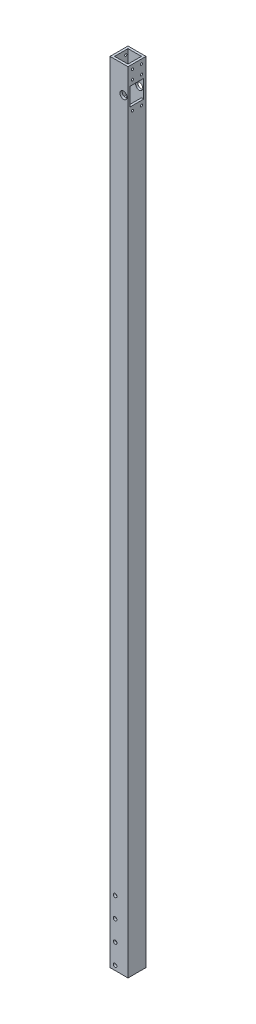
ISO-10303-21;
HEADER;
FILE_DESCRIPTION(('STEP AP214'),'2;1');
FILE_NAME('part.step','',(''),(''),'','','');
FILE_SCHEMA(('AUTOMOTIVE_DESIGN { 1 0 10303 214 1 1 1 1 }'));
ENDSEC;
DATA;
#1=APPLICATION_CONTEXT('core data for automotive mechanical design processes');
#2=APPLICATION_PROTOCOL_DEFINITION('international standard','automotive_design',2000,#1);
#3=PRODUCT_CONTEXT('',#1,'mechanical');
#4=PRODUCT('Part','Part','',(#3));
#5=PRODUCT_RELATED_PRODUCT_CATEGORY('part','',(#4));
#6=PRODUCT_DEFINITION_FORMATION('','',#4);
#7=PRODUCT_DEFINITION_CONTEXT('part definition',#1,'design');
#8=PRODUCT_DEFINITION('design','',#6,#7);
#9=PRODUCT_DEFINITION_SHAPE('','',#8);
#10=(LENGTH_UNIT() NAMED_UNIT(*) SI_UNIT(.MILLI.,.METRE.));
#11=(NAMED_UNIT(*) PLANE_ANGLE_UNIT() SI_UNIT($,.RADIAN.));
#12=(NAMED_UNIT(*) SI_UNIT($,.STERADIAN.) SOLID_ANGLE_UNIT());
#13=UNCERTAINTY_MEASURE_WITH_UNIT(LENGTH_MEASURE(1.E-05),#10,'distance_accuracy_value','');
#14=(GEOMETRIC_REPRESENTATION_CONTEXT(3) GLOBAL_UNCERTAINTY_ASSIGNED_CONTEXT((#13)) GLOBAL_UNIT_ASSIGNED_CONTEXT((#10,
#11,#12)) REPRESENTATION_CONTEXT('',''));
#15=CARTESIAN_POINT('',(0.,0.,0.));
#16=DIRECTION('',(0.,0.,1.));
#17=DIRECTION('',(1.,0.,0.));
#18=AXIS2_PLACEMENT_3D('',#15,#16,#17);
#19=CARTESIAN_POINT('',(-9.525,1117.6,-9.525));
#20=DIRECTION('',(1.,0.,0.));
#21=DIRECTION('',(0.,0.,-1.));
#22=AXIS2_PLACEMENT_3D('',#19,#20,#21);
#23=PLANE('',#22);
#24=CARTESIAN_POINT('',(-9.525,1098.55,-6.35000000000001));
#25=DIRECTION('',(1.,0.,0.));
#26=DIRECTION('',(0.,0.,-1.));
#27=AXIS2_PLACEMENT_3D('',#24,#25,#26);
#28=CIRCLE('',#27,1.58750000000007);
#29=CARTESIAN_POINT('',(-9.525,1098.55,-7.93750000000008));
#30=VERTEX_POINT('',#29);
#31=EDGE_CURVE('E243',#30,#30,#28,.T.);
#32=ORIENTED_EDGE('',*,*,#31,.F.);
#33=EDGE_LOOP('',(#32));
#34=FACE_BOUND('',#33,.T.);
#35=CARTESIAN_POINT('',(-9.525,1111.25,6.34999999999993));
#36=DIRECTION('',(1.,0.,0.));
#37=DIRECTION('',(0.,0.,-1.));
#38=AXIS2_PLACEMENT_3D('',#35,#36,#37);
#39=CIRCLE('',#38,1.58750000000007);
#40=CARTESIAN_POINT('',(-9.525,1111.25,4.76249999999986));
#41=VERTEX_POINT('',#40);
#42=EDGE_CURVE('E255',#41,#41,#39,.T.);
#43=ORIENTED_EDGE('',*,*,#42,.F.);
#44=EDGE_LOOP('',(#43));
#45=FACE_BOUND('',#44,.T.);
#46=CARTESIAN_POINT('',(-9.525,1098.55,6.34999999999993));
#47=DIRECTION('',(1.,0.,0.));
#48=DIRECTION('',(0.,0.,-1.));
#49=AXIS2_PLACEMENT_3D('',#46,#47,#48);
#50=CIRCLE('',#49,1.58750000000007);
#51=CARTESIAN_POINT('',(-9.525,1098.55,4.76249999999986));
#52=VERTEX_POINT('',#51);
#53=EDGE_CURVE('E267',#52,#52,#50,.T.);
#54=ORIENTED_EDGE('',*,*,#53,.F.);
#55=EDGE_LOOP('',(#54));
#56=FACE_BOUND('',#55,.T.);
#57=CARTESIAN_POINT('',(-9.525,1111.25,-6.35000000000001));
#58=DIRECTION('',(1.,0.,0.));
#59=DIRECTION('',(0.,0.,-1.));
#60=AXIS2_PLACEMENT_3D('',#57,#58,#59);
#61=CIRCLE('',#60,1.58750000000007);
#62=CARTESIAN_POINT('',(-9.525,1111.25,-7.93750000000008));
#63=VERTEX_POINT('',#62);
#64=EDGE_CURVE('E276',#63,#63,#61,.T.);
#65=ORIENTED_EDGE('',*,*,#64,.F.);
#66=EDGE_LOOP('',(#65));
#67=FACE_BOUND('',#66,.T.);
#68=CARTESIAN_POINT('',(-9.525,1060.45,6.34999999999993));
#69=DIRECTION('',(1.,0.,0.));
#70=DIRECTION('',(0.,0.,-1.));
#71=AXIS2_PLACEMENT_3D('',#68,#69,#70);
#72=CIRCLE('',#71,1.58750000000007);
#73=CARTESIAN_POINT('',(-9.525,1060.45,4.76249999999986));
#74=VERTEX_POINT('',#73);
#75=EDGE_CURVE('E191',#74,#74,#72,.T.);
#76=ORIENTED_EDGE('',*,*,#75,.F.);
#77=EDGE_LOOP('',(#76));
#78=FACE_BOUND('',#77,.T.);
#79=CARTESIAN_POINT('',(-9.525,1060.45,-6.34999999999994));
#80=DIRECTION('',(1.,0.,0.));
#81=DIRECTION('',(0.,0.,-1.));
#82=AXIS2_PLACEMENT_3D('',#79,#80,#81);
#83=CIRCLE('',#82,1.58750000000007);
#84=CARTESIAN_POINT('',(-9.525,1060.45,-7.93750000000002));
#85=VERTEX_POINT('',#84);
#86=EDGE_CURVE('E186',#85,#85,#83,.T.);
#87=ORIENTED_EDGE('',*,*,#86,.F.);
#88=EDGE_LOOP('',(#87));
#89=FACE_BOUND('',#88,.T.);
#90=CARTESIAN_POINT('',(-9.525,82.5500000000001,-4.44089209850063E-13));
#91=DIRECTION('',(1.,0.,0.));
#92=DIRECTION('',(0.,0.,-1.));
#93=AXIS2_PLACEMENT_3D('',#90,#91,#92);
#94=CIRCLE('',#93,2.5527);
#95=CARTESIAN_POINT('',(-9.525,82.5500000000001,-2.55270000000044));
#96=VERTEX_POINT('',#95);
#97=EDGE_CURVE('E299',#96,#96,#94,.F.);
#98=ORIENTED_EDGE('',*,*,#97,.T.);
#99=EDGE_LOOP('',(#98));
#100=FACE_BOUND('',#99,.T.);
#101=CARTESIAN_POINT('',(-9.525,57.1500000000001,-4.44089209850063E-13));
#102=DIRECTION('',(1.,0.,0.));
#103=DIRECTION('',(0.,0.,-1.));
#104=AXIS2_PLACEMENT_3D('',#101,#102,#103);
#105=CIRCLE('',#104,2.55269999999999);
#106=CARTESIAN_POINT('',(-9.525,57.1500000000001,-2.55270000000044));
#107=VERTEX_POINT('',#106);
#108=EDGE_CURVE('E305',#107,#107,#105,.F.);
#109=ORIENTED_EDGE('',*,*,#108,.T.);
#110=EDGE_LOOP('',(#109));
#111=FACE_BOUND('',#110,.T.);
#112=DIRECTION('',(0.,0.,1.));
#113=VECTOR('',#112,1.);
#114=CARTESIAN_POINT('',(-9.525,0.,-9.525));
#115=LINE('',#114,#113);
#116=CARTESIAN_POINT('',(-9.525,0.,-9.525));
#117=VERTEX_POINT('',#116);
#118=CARTESIAN_POINT('',(-9.525,0.,9.525));
#119=VERTEX_POINT('',#118);
#120=EDGE_CURVE('E348',#117,#119,#115,.T.);
#121=ORIENTED_EDGE('',*,*,#120,.F.);
#122=DIRECTION('',(0.,-1.,0.));
#123=VECTOR('',#122,1.);
#124=CARTESIAN_POINT('',(-9.525,1117.6,-9.525));
#125=LINE('',#124,#123);
#126=CARTESIAN_POINT('',(-9.525,1117.6,-9.525));
#127=VERTEX_POINT('',#126);
#128=EDGE_CURVE('E145',#127,#117,#125,.T.);
#129=ORIENTED_EDGE('',*,*,#128,.F.);
#130=DIRECTION('',(0.,0.,1.));
#131=VECTOR('',#130,1.);
#132=CARTESIAN_POINT('',(-9.525,1117.6,-9.525));
#133=LINE('',#132,#131);
#134=CARTESIAN_POINT('',(-9.525,1117.6,9.525));
#135=VERTEX_POINT('',#134);
#136=EDGE_CURVE('E341',#127,#135,#133,.T.);
#137=ORIENTED_EDGE('',*,*,#136,.T.);
#138=DIRECTION('',(0.,-1.,0.));
#139=VECTOR('',#138,1.);
#140=CARTESIAN_POINT('',(-9.525,1117.6,9.525));
#141=LINE('',#140,#139);
#142=EDGE_CURVE('E149',#135,#119,#141,.T.);
#143=ORIENTED_EDGE('',*,*,#142,.T.);
#144=EDGE_LOOP('',(#121,#129,#137,#143));
#145=FACE_BOUND('',#144,.T.);
#146=CARTESIAN_POINT('',(-9.525,12.7000000000001,-4.44089209850063E-13));
#147=DIRECTION('',(1.,0.,0.));
#148=DIRECTION('',(0.,0.,-1.));
#149=AXIS2_PLACEMENT_3D('',#146,#147,#148);
#150=CIRCLE('',#149,2.55269999999999);
#151=CARTESIAN_POINT('',(-9.525,12.7000000000001,-2.55270000000044));
#152=VERTEX_POINT('',#151);
#153=EDGE_CURVE('E311',#152,#152,#150,.F.);
#154=ORIENTED_EDGE('',*,*,#153,.T.);
#155=EDGE_LOOP('',(#154));
#156=FACE_BOUND('',#155,.T.);
#157=ADVANCED_FACE('F32',(#34,#45,#56,#67,#78,#89,#100,#111,#145,#156),#23,.T.);
#158=CARTESIAN_POINT('',(9.525,1117.6,-9.525));
#159=DIRECTION('',(-1.,0.,0.));
#160=DIRECTION('',(0.,0.,1.));
#161=AXIS2_PLACEMENT_3D('',#158,#159,#160);
#162=PLANE('',#161);
#163=CARTESIAN_POINT('',(9.525,1098.55,-6.35000000000001));
#164=DIRECTION('',(-1.,0.,0.));
#165=DIRECTION('',(0.,0.,1.));
#166=AXIS2_PLACEMENT_3D('',#163,#164,#165);
#167=CIRCLE('',#166,1.58750000000007);
#168=CARTESIAN_POINT('',(9.525,1098.55,-4.76249999999993));
#169=VERTEX_POINT('',#168);
#170=EDGE_CURVE('E240',#169,#169,#167,.T.);
#171=ORIENTED_EDGE('',*,*,#170,.F.);
#172=EDGE_LOOP('',(#171));
#173=FACE_BOUND('',#172,.T.);
#174=CARTESIAN_POINT('',(9.525,1111.25,6.34999999999993));
#175=DIRECTION('',(-1.,0.,0.));
#176=DIRECTION('',(0.,0.,1.));
#177=AXIS2_PLACEMENT_3D('',#174,#175,#176);
#178=CIRCLE('',#177,1.58750000000007);
#179=CARTESIAN_POINT('',(9.525,1111.25,7.93750000000001));
#180=VERTEX_POINT('',#179);
#181=EDGE_CURVE('E252',#180,#180,#178,.T.);
#182=ORIENTED_EDGE('',*,*,#181,.F.);
#183=EDGE_LOOP('',(#182));
#184=FACE_BOUND('',#183,.T.);
#185=CARTESIAN_POINT('',(9.525,1098.55,6.34999999999993));
#186=DIRECTION('',(-1.,0.,0.));
#187=DIRECTION('',(0.,0.,1.));
#188=AXIS2_PLACEMENT_3D('',#185,#186,#187);
#189=CIRCLE('',#188,1.58750000000007);
#190=CARTESIAN_POINT('',(9.525,1098.55,7.93750000000001));
#191=VERTEX_POINT('',#190);
#192=EDGE_CURVE('E264',#191,#191,#189,.T.);
#193=ORIENTED_EDGE('',*,*,#192,.F.);
#194=EDGE_LOOP('',(#193));
#195=FACE_BOUND('',#194,.T.);
#196=CARTESIAN_POINT('',(9.525,1111.25,-6.35000000000001));
#197=DIRECTION('',(-1.,0.,0.));
#198=DIRECTION('',(0.,0.,1.));
#199=AXIS2_PLACEMENT_3D('',#196,#197,#198);
#200=CIRCLE('',#199,1.58750000000007);
#201=CARTESIAN_POINT('',(9.525,1111.25,-4.76249999999993));
#202=VERTEX_POINT('',#201);
#203=EDGE_CURVE('E279',#202,#202,#200,.T.);
#204=ORIENTED_EDGE('',*,*,#203,.F.);
#205=EDGE_LOOP('',(#204));
#206=FACE_BOUND('',#205,.T.);
#207=DIRECTION('',(0.,0.,1.));
#208=VECTOR('',#207,1.);
#209=CARTESIAN_POINT('',(9.525,1092.2,9.525));
#210=LINE('',#209,#208);
#211=CARTESIAN_POINT('',(9.525,1092.2,-9.525));
#212=VERTEX_POINT('',#211);
#213=CARTESIAN_POINT('',(9.525,1092.2,9.525));
#214=VERTEX_POINT('',#213);
#215=EDGE_CURVE('E329',#212,#214,#210,.T.);
#216=ORIENTED_EDGE('',*,*,#215,.T.);
#217=DIRECTION('',(0.,-1.,0.));
#218=VECTOR('',#217,1.);
#219=CARTESIAN_POINT('',(9.525,1117.6,9.525));
#220=LINE('',#219,#218);
#221=CARTESIAN_POINT('',(9.525,1117.6,9.525));
#222=VERTEX_POINT('',#221);
#223=EDGE_CURVE('E353',#222,#214,#220,.T.);
#224=ORIENTED_EDGE('',*,*,#223,.F.);
#225=DIRECTION('',(0.,0.,-1.));
#226=VECTOR('',#225,1.);
#227=CARTESIAN_POINT('',(9.525,1117.6,-9.525));
#228=LINE('',#227,#226);
#229=CARTESIAN_POINT('',(9.525,1117.6,-9.525));
#230=VERTEX_POINT('',#229);
#231=EDGE_CURVE('E336',#222,#230,#228,.T.);
#232=ORIENTED_EDGE('',*,*,#231,.T.);
#233=DIRECTION('',(0.,-1.,0.));
#234=VECTOR('',#233,1.);
#235=CARTESIAN_POINT('',(9.525,1117.6,-9.525));
#236=LINE('',#235,#234);
#237=EDGE_CURVE('E144',#230,#212,#236,.T.);
#238=ORIENTED_EDGE('',*,*,#237,.T.);
#239=EDGE_LOOP('',(#216,#224,#232,#238));
#240=FACE_BOUND('',#239,.T.);
#241=ADVANCED_FACE('F375',(#173,#184,#195,#206,#240),#162,.T.);
#242=CARTESIAN_POINT('',(0.,1117.6,0.));
#243=DIRECTION('',(0.,1.,0.));
#244=DIRECTION('',(0.,0.,1.));
#245=AXIS2_PLACEMENT_3D('',#242,#243,#244);
#246=PLANE('',#245);
#247=DIRECTION('',(0.,0.,-1.));
#248=VECTOR('',#247,1.);
#249=CARTESIAN_POINT('',(12.7,1117.6,-12.7));
#250=LINE('',#249,#248);
#251=CARTESIAN_POINT('',(12.7,1117.6,12.7));
#252=VERTEX_POINT('',#251);
#253=CARTESIAN_POINT('',(12.7,1117.6,-12.7));
#254=VERTEX_POINT('',#253);
#255=EDGE_CURVE('E153',#252,#254,#250,.T.);
#256=ORIENTED_EDGE('',*,*,#255,.T.);
#257=DIRECTION('',(-1.,0.,0.));
#258=VECTOR('',#257,1.);
#259=CARTESIAN_POINT('',(-12.7,1117.6,-12.7));
#260=LINE('',#259,#258);
#261=CARTESIAN_POINT('',(-12.7,1117.6,-12.7));
#262=VERTEX_POINT('',#261);
#263=EDGE_CURVE('E156',#254,#262,#260,.T.);
#264=ORIENTED_EDGE('',*,*,#263,.T.);
#265=DIRECTION('',(0.,0.,1.));
#266=VECTOR('',#265,1.);
#267=CARTESIAN_POINT('',(-12.7,1117.6,-12.7));
#268=LINE('',#267,#266);
#269=CARTESIAN_POINT('',(-12.7,1117.6,12.7));
#270=VERTEX_POINT('',#269);
#271=EDGE_CURVE('E159',#262,#270,#268,.T.);
#272=ORIENTED_EDGE('',*,*,#271,.T.);
#273=DIRECTION('',(1.,0.,0.));
#274=VECTOR('',#273,1.);
#275=CARTESIAN_POINT('',(-12.7,1117.6,12.7));
#276=LINE('',#275,#274);
#277=EDGE_CURVE('E161',#270,#252,#276,.T.);
#278=ORIENTED_EDGE('',*,*,#277,.T.);
#279=EDGE_LOOP('',(#256,#264,#272,#278));
#280=FACE_BOUND('',#279,.T.);
#281=DIRECTION('',(-1.,0.,0.));
#282=VECTOR('',#281,1.);
#283=CARTESIAN_POINT('',(-9.525,1117.6,-9.525));
#284=LINE('',#283,#282);
#285=EDGE_CURVE('E338',#230,#127,#284,.T.);
#286=ORIENTED_EDGE('',*,*,#285,.F.);
#287=ORIENTED_EDGE('',*,*,#231,.F.);
#288=DIRECTION('',(1.,0.,0.));
#289=VECTOR('',#288,1.);
#290=CARTESIAN_POINT('',(-9.525,1117.6,9.525));
#291=LINE('',#290,#289);
#292=EDGE_CURVE('E344',#135,#222,#291,.T.);
#293=ORIENTED_EDGE('',*,*,#292,.F.);
#294=ORIENTED_EDGE('',*,*,#136,.F.);
#295=EDGE_LOOP('',(#286,#287,#293,#294));
#296=FACE_BOUND('',#295,.T.);
#297=ADVANCED_FACE('F366',(#280,#296),#246,.T.);
#298=CARTESIAN_POINT('',(0.,0.,0.));
#299=DIRECTION('',(0.,1.,0.));
#300=DIRECTION('',(0.,0.,1.));
#301=AXIS2_PLACEMENT_3D('',#298,#299,#300);
#302=PLANE('',#301);
#303=DIRECTION('',(0.,0.,-1.));
#304=VECTOR('',#303,1.);
#305=CARTESIAN_POINT('',(12.7,0.,-12.7));
#306=LINE('',#305,#304);
#307=CARTESIAN_POINT('',(12.7,0.,12.7));
#308=VERTEX_POINT('',#307);
#309=CARTESIAN_POINT('',(12.7,0.,-12.7));
#310=VERTEX_POINT('',#309);
#311=EDGE_CURVE('E148',#308,#310,#306,.T.);
#312=ORIENTED_EDGE('',*,*,#311,.F.);
#313=DIRECTION('',(1.,0.,0.));
#314=VECTOR('',#313,1.);
#315=CARTESIAN_POINT('',(-12.7,0.,12.7));
#316=LINE('',#315,#314);
#317=CARTESIAN_POINT('',(-12.7,0.,12.7));
#318=VERTEX_POINT('',#317);
#319=EDGE_CURVE('E157',#318,#308,#316,.T.);
#320=ORIENTED_EDGE('',*,*,#319,.F.);
#321=DIRECTION('',(0.,0.,1.));
#322=VECTOR('',#321,1.);
#323=CARTESIAN_POINT('',(-12.7,0.,-12.7));
#324=LINE('',#323,#322);
#325=CARTESIAN_POINT('',(-12.7,0.,-12.7));
#326=VERTEX_POINT('',#325);
#327=EDGE_CURVE('E168',#326,#318,#324,.T.);
#328=ORIENTED_EDGE('',*,*,#327,.F.);
#329=DIRECTION('',(-1.,0.,0.));
#330=VECTOR('',#329,1.);
#331=CARTESIAN_POINT('',(-12.7,0.,-12.7));
#332=LINE('',#331,#330);
#333=EDGE_CURVE('E166',#310,#326,#332,.T.);
#334=ORIENTED_EDGE('',*,*,#333,.F.);
#335=EDGE_LOOP('',(#312,#320,#328,#334));
#336=FACE_BOUND('',#335,.T.);
#337=DIRECTION('',(0.,0.,-1.));
#338=VECTOR('',#337,1.);
#339=CARTESIAN_POINT('',(9.525,0.,-9.525));
#340=LINE('',#339,#338);
#341=CARTESIAN_POINT('',(9.525,0.,9.525));
#342=VERTEX_POINT('',#341);
#343=CARTESIAN_POINT('',(9.525,0.,-9.525));
#344=VERTEX_POINT('',#343);
#345=EDGE_CURVE('E324',#342,#344,#340,.T.);
#346=ORIENTED_EDGE('',*,*,#345,.T.);
#347=DIRECTION('',(-1.,0.,0.));
#348=VECTOR('',#347,1.);
#349=CARTESIAN_POINT('',(-9.525,0.,-9.525));
#350=LINE('',#349,#348);
#351=EDGE_CURVE('E142',#344,#117,#350,.T.);
#352=ORIENTED_EDGE('',*,*,#351,.T.);
#353=ORIENTED_EDGE('',*,*,#120,.T.);
#354=DIRECTION('',(1.,0.,0.));
#355=VECTOR('',#354,1.);
#356=CARTESIAN_POINT('',(-9.525,0.,9.525));
#357=LINE('',#356,#355);
#358=EDGE_CURVE('E339',#119,#342,#357,.T.);
#359=ORIENTED_EDGE('',*,*,#358,.T.);
#360=EDGE_LOOP('',(#346,#352,#353,#359));
#361=FACE_BOUND('',#360,.T.);
#362=ADVANCED_FACE('F364',(#336,#361),#302,.F.);
#363=CARTESIAN_POINT('',(12.7,1117.6,-12.7));
#364=DIRECTION('',(-1.,0.,0.));
#365=DIRECTION('',(0.,0.,1.));
#366=AXIS2_PLACEMENT_3D('',#363,#364,#365);
#367=PLANE('',#366);
#368=CARTESIAN_POINT('',(12.7,1098.55,-6.35000000000001));
#369=DIRECTION('',(1.,0.,0.));
#370=DIRECTION('',(0.,0.,-1.));
#371=AXIS2_PLACEMENT_3D('',#368,#369,#370);
#372=CIRCLE('',#371,1.58750000000007);
#373=CARTESIAN_POINT('',(12.7,1098.55,-7.93750000000008));
#374=VERTEX_POINT('',#373);
#375=EDGE_CURVE('E234',#374,#374,#372,.T.);
#376=ORIENTED_EDGE('',*,*,#375,.F.);
#377=EDGE_LOOP('',(#376));
#378=FACE_BOUND('',#377,.T.);
#379=CARTESIAN_POINT('',(12.7,1111.25,6.34999999999993));
#380=DIRECTION('',(1.,0.,0.));
#381=DIRECTION('',(0.,0.,-1.));
#382=AXIS2_PLACEMENT_3D('',#379,#380,#381);
#383=CIRCLE('',#382,1.58750000000007);
#384=CARTESIAN_POINT('',(12.7,1111.25,4.76249999999986));
#385=VERTEX_POINT('',#384);
#386=EDGE_CURVE('E246',#385,#385,#383,.T.);
#387=ORIENTED_EDGE('',*,*,#386,.F.);
#388=EDGE_LOOP('',(#387));
#389=FACE_BOUND('',#388,.T.);
#390=CARTESIAN_POINT('',(12.7,1098.55,6.34999999999993));
#391=DIRECTION('',(1.,0.,0.));
#392=DIRECTION('',(0.,0.,-1.));
#393=AXIS2_PLACEMENT_3D('',#390,#391,#392);
#394=CIRCLE('',#393,1.58750000000007);
#395=CARTESIAN_POINT('',(12.7,1098.55,4.76249999999986));
#396=VERTEX_POINT('',#395);
#397=EDGE_CURVE('E258',#396,#396,#394,.T.);
#398=ORIENTED_EDGE('',*,*,#397,.F.);
#399=EDGE_LOOP('',(#398));
#400=FACE_BOUND('',#399,.T.);
#401=CARTESIAN_POINT('',(12.7,1111.25,-6.35000000000001));
#402=DIRECTION('',(1.,0.,0.));
#403=DIRECTION('',(0.,0.,-1.));
#404=AXIS2_PLACEMENT_3D('',#401,#402,#403);
#405=CIRCLE('',#404,1.58750000000007);
#406=CARTESIAN_POINT('',(12.7,1111.25,-7.93750000000008));
#407=VERTEX_POINT('',#406);
#408=EDGE_CURVE('E270',#407,#407,#405,.T.);
#409=ORIENTED_EDGE('',*,*,#408,.F.);
#410=EDGE_LOOP('',(#409));
#411=FACE_BOUND('',#410,.T.);
#412=CARTESIAN_POINT('',(12.7,1060.45,6.34999999999993));
#413=DIRECTION('',(1.,0.,0.));
#414=DIRECTION('',(0.,0.,-1.));
#415=AXIS2_PLACEMENT_3D('',#412,#413,#414);
#416=CIRCLE('',#415,1.58750000000007);
#417=CARTESIAN_POINT('',(12.7,1060.45,4.76249999999986));
#418=VERTEX_POINT('',#417);
#419=EDGE_CURVE('E282',#418,#418,#416,.T.);
#420=ORIENTED_EDGE('',*,*,#419,.F.);
#421=EDGE_LOOP('',(#420));
#422=FACE_BOUND('',#421,.T.);
#423=CARTESIAN_POINT('',(12.7,1060.45,-6.34999999999994));
#424=DIRECTION('',(1.,0.,0.));
#425=DIRECTION('',(0.,0.,-1.));
#426=AXIS2_PLACEMENT_3D('',#423,#424,#425);
#427=CIRCLE('',#426,1.58750000000007);
#428=CARTESIAN_POINT('',(12.7,1060.45,-7.93750000000002));
#429=VERTEX_POINT('',#428);
#430=EDGE_CURVE('E289',#429,#429,#427,.T.);
#431=ORIENTED_EDGE('',*,*,#430,.F.);
#432=EDGE_LOOP('',(#431));
#433=FACE_BOUND('',#432,.T.);
#434=DIRECTION('',(0.,0.,-1.));
#435=VECTOR('',#434,1.);
#436=CARTESIAN_POINT('',(12.7,1066.8,9.525));
#437=LINE('',#436,#435);
#438=CARTESIAN_POINT('',(12.7,1066.8,9.525));
#439=VERTEX_POINT('',#438);
#440=CARTESIAN_POINT('',(12.7,1066.8,-9.525));
#441=VERTEX_POINT('',#440);
#442=EDGE_CURVE('E126',#439,#441,#437,.T.);
#443=ORIENTED_EDGE('',*,*,#442,.F.);
#444=DIRECTION('',(0.,-1.,0.));
#445=VECTOR('',#444,1.);
#446=CARTESIAN_POINT('',(12.7,1092.2,9.525));
#447=LINE('',#446,#445);
#448=CARTESIAN_POINT('',(12.7,1092.2,9.525));
#449=VERTEX_POINT('',#448);
#450=EDGE_CURVE('E49',#449,#439,#447,.T.);
#451=ORIENTED_EDGE('',*,*,#450,.F.);
#452=DIRECTION('',(0.,0.,1.));
#453=VECTOR('',#452,1.);
#454=CARTESIAN_POINT('',(12.7,1092.2,9.525));
#455=LINE('',#454,#453);
#456=CARTESIAN_POINT('',(12.7,1092.2,-9.525));
#457=VERTEX_POINT('',#456);
#458=EDGE_CURVE('E321',#457,#449,#455,.T.);
#459=ORIENTED_EDGE('',*,*,#458,.F.);
#460=DIRECTION('',(0.,1.,0.));
#461=VECTOR('',#460,1.);
#462=CARTESIAN_POINT('',(12.7,1092.2,-9.525));
#463=LINE('',#462,#461);
#464=EDGE_CURVE('E325',#441,#457,#463,.T.);
#465=ORIENTED_EDGE('',*,*,#464,.F.);
#466=EDGE_LOOP('',(#443,#451,#459,#465));
#467=FACE_BOUND('',#466,.T.);
#468=ORIENTED_EDGE('',*,*,#311,.T.);
#469=DIRECTION('',(0.,-1.,0.));
#470=VECTOR('',#469,1.);
#471=CARTESIAN_POINT('',(12.7,1117.6,-12.7));
#472=LINE('',#471,#470);
#473=EDGE_CURVE('E11',#254,#310,#472,.T.);
#474=ORIENTED_EDGE('',*,*,#473,.F.);
#475=ORIENTED_EDGE('',*,*,#255,.F.);
#476=DIRECTION('',(0.,-1.,0.));
#477=VECTOR('',#476,1.);
#478=CARTESIAN_POINT('',(12.7,1117.6,12.7));
#479=LINE('',#478,#477);
#480=EDGE_CURVE('E163',#252,#308,#479,.T.);
#481=ORIENTED_EDGE('',*,*,#480,.T.);
#482=EDGE_LOOP('',(#468,#474,#475,#481));
#483=FACE_BOUND('',#482,.T.);
#484=ADVANCED_FACE('F34',(#378,#389,#400,#411,#422,#433,#467,#483),#367,.F.);
#485=CARTESIAN_POINT('',(-12.7,1117.6,-12.7));
#486=DIRECTION('',(0.,0.,1.));
#487=DIRECTION('',(1.,0.,0.));
#488=AXIS2_PLACEMENT_3D('',#485,#486,#487);
#489=PLANE('',#488);
#490=CARTESIAN_POINT('',(-5.55624999999339,6.35000000000233,-12.7));
#491=DIRECTION('',(0.,0.,1.));
#492=DIRECTION('',(1.,0.,0.));
#493=AXIS2_PLACEMENT_3D('',#490,#491,#492);
#494=CIRCLE('',#493,2.5527);
#495=CARTESIAN_POINT('',(-3.0035499999934,6.35000000000233,-12.7));
#496=VERTEX_POINT('',#495);
#497=EDGE_CURVE('E717',#496,#496,#494,.T.);
#498=ORIENTED_EDGE('',*,*,#497,.T.);
#499=EDGE_LOOP('',(#498));
#500=FACE_BOUND('',#499,.T.);
#501=CARTESIAN_POINT('',(-5.55624999999339,34.9250000000023,-12.7));
#502=DIRECTION('',(0.,0.,1.));
#503=DIRECTION('',(1.,0.,0.));
#504=AXIS2_PLACEMENT_3D('',#501,#502,#503);
#505=CIRCLE('',#504,2.5527);
#506=CARTESIAN_POINT('',(-3.0035499999934,34.9250000000023,-12.7));
#507=VERTEX_POINT('',#506);
#508=EDGE_CURVE('E205',#507,#507,#505,.T.);
#509=ORIENTED_EDGE('',*,*,#508,.T.);
#510=EDGE_LOOP('',(#509));
#511=FACE_BOUND('',#510,.T.);
#512=CARTESIAN_POINT('',(-5.55624999999339,92.0750000000023,-12.7));
#513=DIRECTION('',(0.,0.,1.));
#514=DIRECTION('',(1.,0.,0.));
#515=AXIS2_PLACEMENT_3D('',#512,#513,#514);
#516=CIRCLE('',#515,2.5527);
#517=CARTESIAN_POINT('',(-3.0035499999934,92.0750000000023,-12.7));
#518=VERTEX_POINT('',#517);
#519=EDGE_CURVE('E201',#518,#518,#516,.T.);
#520=ORIENTED_EDGE('',*,*,#519,.T.);
#521=EDGE_LOOP('',(#520));
#522=FACE_BOUND('',#521,.T.);
#523=CARTESIAN_POINT('',(-5.55624999999339,63.5000000000023,-12.7));
#524=DIRECTION('',(0.,0.,1.));
#525=DIRECTION('',(1.,0.,0.));
#526=AXIS2_PLACEMENT_3D('',#523,#524,#525);
#527=CIRCLE('',#526,2.5527);
#528=CARTESIAN_POINT('',(-3.0035499999934,63.5000000000023,-12.7));
#529=VERTEX_POINT('',#528);
#530=EDGE_CURVE('E197',#529,#529,#527,.T.);
#531=ORIENTED_EDGE('',*,*,#530,.T.);
#532=EDGE_LOOP('',(#531));
#533=FACE_BOUND('',#532,.T.);
#534=CARTESIAN_POINT('',(6.35,1079.5,-12.7));
#535=DIRECTION('',(0.,0.,1.));
#536=DIRECTION('',(1.,0.,0.));
#537=AXIS2_PLACEMENT_3D('',#534,#535,#536);
#538=CIRCLE('',#537,5.0419);
#539=CARTESIAN_POINT('',(11.3919,1079.5,-12.7));
#540=VERTEX_POINT('',#539);
#541=EDGE_CURVE('E182',#540,#540,#538,.T.);
#542=ORIENTED_EDGE('',*,*,#541,.T.);
#543=EDGE_LOOP('',(#542));
#544=FACE_BOUND('',#543,.T.);
#545=ORIENTED_EDGE('',*,*,#333,.T.);
#546=DIRECTION('',(0.,-1.,0.));
#547=VECTOR('',#546,1.);
#548=CARTESIAN_POINT('',(-12.7,1117.6,-12.7));
#549=LINE('',#548,#547);
#550=EDGE_CURVE('E41',#262,#326,#549,.T.);
#551=ORIENTED_EDGE('',*,*,#550,.F.);
#552=ORIENTED_EDGE('',*,*,#263,.F.);
#553=ORIENTED_EDGE('',*,*,#473,.T.);
#554=EDGE_LOOP('',(#545,#551,#552,#553));
#555=FACE_BOUND('',#554,.T.);
#556=ADVANCED_FACE('F373',(#500,#511,#522,#533,#544,#555),#489,.F.);
#557=CARTESIAN_POINT('',(-12.7,1117.6,-12.7));
#558=DIRECTION('',(1.,0.,0.));
#559=DIRECTION('',(0.,0.,-1.));
#560=AXIS2_PLACEMENT_3D('',#557,#558,#559);
#561=PLANE('',#560);
#562=CARTESIAN_POINT('',(-12.7,1098.55,-6.35000000000001));
#563=DIRECTION('',(1.,0.,0.));
#564=DIRECTION('',(0.,0.,-1.));
#565=AXIS2_PLACEMENT_3D('',#562,#563,#564);
#566=CIRCLE('',#565,1.58750000000007);
#567=CARTESIAN_POINT('',(-12.7,1098.55,-7.93750000000008));
#568=VERTEX_POINT('',#567);
#569=EDGE_CURVE('E237',#568,#568,#566,.T.);
#570=ORIENTED_EDGE('',*,*,#569,.T.);
#571=EDGE_LOOP('',(#570));
#572=FACE_BOUND('',#571,.T.);
#573=CARTESIAN_POINT('',(-12.7,1111.25,6.34999999999993));
#574=DIRECTION('',(1.,0.,0.));
#575=DIRECTION('',(0.,0.,-1.));
#576=AXIS2_PLACEMENT_3D('',#573,#574,#575);
#577=CIRCLE('',#576,1.58750000000007);
#578=CARTESIAN_POINT('',(-12.7,1111.25,4.76249999999986));
#579=VERTEX_POINT('',#578);
#580=EDGE_CURVE('E249',#579,#579,#577,.T.);
#581=ORIENTED_EDGE('',*,*,#580,.T.);
#582=EDGE_LOOP('',(#581));
#583=FACE_BOUND('',#582,.T.);
#584=CARTESIAN_POINT('',(-12.7,1098.55,6.34999999999993));
#585=DIRECTION('',(1.,0.,0.));
#586=DIRECTION('',(0.,0.,-1.));
#587=AXIS2_PLACEMENT_3D('',#584,#585,#586);
#588=CIRCLE('',#587,1.58750000000007);
#589=CARTESIAN_POINT('',(-12.7,1098.55,4.76249999999986));
#590=VERTEX_POINT('',#589);
#591=EDGE_CURVE('E261',#590,#590,#588,.T.);
#592=ORIENTED_EDGE('',*,*,#591,.T.);
#593=EDGE_LOOP('',(#592));
#594=FACE_BOUND('',#593,.T.);
#595=CARTESIAN_POINT('',(-12.7,1111.25,-6.35000000000001));
#596=DIRECTION('',(1.,0.,0.));
#597=DIRECTION('',(0.,0.,-1.));
#598=AXIS2_PLACEMENT_3D('',#595,#596,#597);
#599=CIRCLE('',#598,1.58750000000007);
#600=CARTESIAN_POINT('',(-12.7,1111.25,-7.93750000000008));
#601=VERTEX_POINT('',#600);
#602=EDGE_CURVE('E273',#601,#601,#599,.T.);
#603=ORIENTED_EDGE('',*,*,#602,.T.);
#604=EDGE_LOOP('',(#603));
#605=FACE_BOUND('',#604,.T.);
#606=CARTESIAN_POINT('',(-12.7,1060.45,6.34999999999993));
#607=DIRECTION('',(1.,0.,0.));
#608=DIRECTION('',(0.,0.,-1.));
#609=AXIS2_PLACEMENT_3D('',#606,#607,#608);
#610=CIRCLE('',#609,1.58750000000007);
#611=CARTESIAN_POINT('',(-12.7,1060.45,4.76249999999986));
#612=VERTEX_POINT('',#611);
#613=EDGE_CURVE('E192',#612,#612,#610,.T.);
#614=ORIENTED_EDGE('',*,*,#613,.T.);
#615=EDGE_LOOP('',(#614));
#616=FACE_BOUND('',#615,.T.);
#617=CARTESIAN_POINT('',(-12.7,1060.45,-6.34999999999994));
#618=DIRECTION('',(1.,0.,0.));
#619=DIRECTION('',(0.,0.,-1.));
#620=AXIS2_PLACEMENT_3D('',#617,#618,#619);
#621=CIRCLE('',#620,1.58750000000007);
#622=CARTESIAN_POINT('',(-12.7,1060.45,-7.93750000000002));
#623=VERTEX_POINT('',#622);
#624=EDGE_CURVE('E187',#623,#623,#621,.T.);
#625=ORIENTED_EDGE('',*,*,#624,.T.);
#626=EDGE_LOOP('',(#625));
#627=FACE_BOUND('',#626,.T.);
#628=CARTESIAN_POINT('',(-12.7,82.5500000000001,-4.44089209850063E-13));
#629=DIRECTION('',(-1.,0.,0.));
#630=DIRECTION('',(0.,0.,1.));
#631=AXIS2_PLACEMENT_3D('',#628,#629,#630);
#632=CIRCLE('',#631,2.55269999999999);
#633=CARTESIAN_POINT('',(-12.7,82.5500000000001,2.55269999999955));
#634=VERTEX_POINT('',#633);
#635=EDGE_CURVE('E296',#634,#634,#632,.T.);
#636=ORIENTED_EDGE('',*,*,#635,.F.);
#637=EDGE_LOOP('',(#636));
#638=FACE_BOUND('',#637,.T.);
#639=CARTESIAN_POINT('',(-12.7,57.1500000000001,-4.44089209850063E-13));
#640=DIRECTION('',(-1.,0.,0.));
#641=DIRECTION('',(0.,0.,1.));
#642=AXIS2_PLACEMENT_3D('',#639,#640,#641);
#643=CIRCLE('',#642,2.55269999999999);
#644=CARTESIAN_POINT('',(-12.7,57.1500000000001,2.55269999999955));
#645=VERTEX_POINT('',#644);
#646=EDGE_CURVE('E302',#645,#645,#643,.T.);
#647=ORIENTED_EDGE('',*,*,#646,.F.);
#648=EDGE_LOOP('',(#647));
#649=FACE_BOUND('',#648,.T.);
#650=CARTESIAN_POINT('',(-12.7,12.7000000000001,-4.44089209850063E-13));
#651=DIRECTION('',(-1.,0.,0.));
#652=DIRECTION('',(0.,0.,1.));
#653=AXIS2_PLACEMENT_3D('',#650,#651,#652);
#654=CIRCLE('',#653,2.55269999999999);
#655=CARTESIAN_POINT('',(-12.7,12.7000000000001,2.55269999999955));
#656=VERTEX_POINT('',#655);
#657=EDGE_CURVE('E308',#656,#656,#654,.T.);
#658=ORIENTED_EDGE('',*,*,#657,.F.);
#659=EDGE_LOOP('',(#658));
#660=FACE_BOUND('',#659,.T.);
#661=ORIENTED_EDGE('',*,*,#327,.T.);
#662=DIRECTION('',(0.,-1.,0.));
#663=VECTOR('',#662,1.);
#664=CARTESIAN_POINT('',(-12.7,1117.6,12.7));
#665=LINE('',#664,#663);
#666=EDGE_CURVE('E173',#270,#318,#665,.T.);
#667=ORIENTED_EDGE('',*,*,#666,.F.);
#668=ORIENTED_EDGE('',*,*,#271,.F.);
#669=ORIENTED_EDGE('',*,*,#550,.T.);
#670=EDGE_LOOP('',(#661,#667,#668,#669));
#671=FACE_BOUND('',#670,.T.);
#672=ADVANCED_FACE('F401',(#572,#583,#594,#605,#616,#627,#638,#649,#660,#671),#561,.F.);
#673=CARTESIAN_POINT('',(-12.7,1117.6,12.7));
#674=DIRECTION('',(0.,0.,-1.));
#675=DIRECTION('',(-1.,0.,0.));
#676=AXIS2_PLACEMENT_3D('',#673,#674,#675);
#677=PLANE('',#676);
#678=CARTESIAN_POINT('',(-5.55624999999339,6.35000000000233,12.7));
#679=DIRECTION('',(0.,0.,1.));
#680=DIRECTION('',(1.,0.,0.));
#681=AXIS2_PLACEMENT_3D('',#678,#679,#680);
#682=CIRCLE('',#681,2.5527);
#683=CARTESIAN_POINT('',(-3.00354999999339,6.35000000000233,12.7));
#684=VERTEX_POINT('',#683);
#685=EDGE_CURVE('E718',#684,#684,#682,.T.);
#686=ORIENTED_EDGE('',*,*,#685,.F.);
#687=EDGE_LOOP('',(#686));
#688=FACE_BOUND('',#687,.T.);
#689=CARTESIAN_POINT('',(-5.55624999999339,34.9250000000023,12.7));
#690=DIRECTION('',(0.,0.,1.));
#691=DIRECTION('',(1.,0.,0.));
#692=AXIS2_PLACEMENT_3D('',#689,#690,#691);
#693=CIRCLE('',#692,2.5527);
#694=CARTESIAN_POINT('',(-3.00354999999339,34.9250000000023,12.7));
#695=VERTEX_POINT('',#694);
#696=EDGE_CURVE('E212',#695,#695,#693,.T.);
#697=ORIENTED_EDGE('',*,*,#696,.F.);
#698=EDGE_LOOP('',(#697));
#699=FACE_BOUND('',#698,.T.);
#700=CARTESIAN_POINT('',(-5.55624999999339,92.0750000000023,12.7));
#701=DIRECTION('',(0.,0.,1.));
#702=DIRECTION('',(1.,0.,0.));
#703=AXIS2_PLACEMENT_3D('',#700,#701,#702);
#704=CIRCLE('',#703,2.5527);
#705=CARTESIAN_POINT('',(-3.00354999999339,92.0750000000023,12.7));
#706=VERTEX_POINT('',#705);
#707=EDGE_CURVE('E209',#706,#706,#704,.T.);
#708=ORIENTED_EDGE('',*,*,#707,.F.);
#709=EDGE_LOOP('',(#708));
#710=FACE_BOUND('',#709,.T.);
#711=CARTESIAN_POINT('',(-5.55624999999339,63.5000000000023,12.7));
#712=DIRECTION('',(0.,0.,1.));
#713=DIRECTION('',(1.,0.,0.));
#714=AXIS2_PLACEMENT_3D('',#711,#712,#713);
#715=CIRCLE('',#714,2.5527);
#716=CARTESIAN_POINT('',(-3.00354999999339,63.5000000000023,12.7));
#717=VERTEX_POINT('',#716);
#718=EDGE_CURVE('E227',#717,#717,#715,.T.);
#719=ORIENTED_EDGE('',*,*,#718,.F.);
#720=EDGE_LOOP('',(#719));
#721=FACE_BOUND('',#720,.T.);
#722=CARTESIAN_POINT('',(6.35,1079.5,12.7));
#723=DIRECTION('',(0.,0.,1.));
#724=DIRECTION('',(1.,0.,0.));
#725=AXIS2_PLACEMENT_3D('',#722,#723,#724);
#726=CIRCLE('',#725,5.04189999999999);
#727=CARTESIAN_POINT('',(11.3919,1079.5,12.7));
#728=VERTEX_POINT('',#727);
#729=EDGE_CURVE('E314',#728,#728,#726,.T.);
#730=ORIENTED_EDGE('',*,*,#729,.F.);
#731=EDGE_LOOP('',(#730));
#732=FACE_BOUND('',#731,.T.);
#733=ORIENTED_EDGE('',*,*,#319,.T.);
#734=ORIENTED_EDGE('',*,*,#480,.F.);
#735=ORIENTED_EDGE('',*,*,#277,.F.);
#736=ORIENTED_EDGE('',*,*,#666,.T.);
#737=EDGE_LOOP('',(#733,#734,#735,#736));
#738=FACE_BOUND('',#737,.T.);
#739=ADVANCED_FACE('F396',(#688,#699,#710,#721,#732,#738),#677,.F.);
#740=CARTESIAN_POINT('',(9.525,1060.45,6.34999999999993));
#741=DIRECTION('',(-1.,0.,0.));
#742=DIRECTION('',(0.,0.,1.));
#743=AXIS2_PLACEMENT_3D('',#740,#741,#742);
#744=CIRCLE('',#743,1.58750000000007);
#745=CARTESIAN_POINT('',(9.525,1060.45,7.93750000000001));
#746=VERTEX_POINT('',#745);
#747=EDGE_CURVE('E188',#746,#746,#744,.T.);
#748=ORIENTED_EDGE('',*,*,#747,.F.);
#749=EDGE_LOOP('',(#748));
#750=FACE_BOUND('',#749,.T.);
#751=CARTESIAN_POINT('',(9.525,1060.45,-6.34999999999994));
#752=DIRECTION('',(-1.,0.,0.));
#753=DIRECTION('',(0.,0.,1.));
#754=AXIS2_PLACEMENT_3D('',#751,#752,#753);
#755=CIRCLE('',#754,1.58750000000007);
#756=CARTESIAN_POINT('',(9.525,1060.45,-4.76249999999987));
#757=VERTEX_POINT('',#756);
#758=EDGE_CURVE('E183',#757,#757,#755,.T.);
#759=ORIENTED_EDGE('',*,*,#758,.F.);
#760=EDGE_LOOP('',(#759));
#761=FACE_BOUND('',#760,.T.);
#762=DIRECTION('',(0.,0.,-1.));
#763=VECTOR('',#762,1.);
#764=CARTESIAN_POINT('',(9.525,1066.8,9.525));
#765=LINE('',#764,#763);
#766=CARTESIAN_POINT('',(9.525,1066.8,9.525));
#767=VERTEX_POINT('',#766);
#768=CARTESIAN_POINT('',(9.52499999999999,1066.8,-9.525));
#769=VERTEX_POINT('',#768);
#770=EDGE_CURVE('E123',#767,#769,#765,.T.);
#771=ORIENTED_EDGE('',*,*,#770,.T.);
#772=EDGE_CURVE('E135',#769,#344,#236,.T.);
#773=ORIENTED_EDGE('',*,*,#772,.T.);
#774=ORIENTED_EDGE('',*,*,#345,.F.);
#775=EDGE_CURVE('E137',#767,#342,#220,.T.);
#776=ORIENTED_EDGE('',*,*,#775,.F.);
#777=EDGE_LOOP('',(#771,#773,#774,#776));
#778=FACE_BOUND('',#777,.T.);
#779=ADVANCED_FACE('F133',(#750,#761,#778),#162,.T.);
#780=CARTESIAN_POINT('',(-9.525,1117.6,-9.525));
#781=DIRECTION('',(0.,0.,1.));
#782=DIRECTION('',(1.,0.,0.));
#783=AXIS2_PLACEMENT_3D('',#780,#781,#782);
#784=PLANE('',#783);
#785=CARTESIAN_POINT('',(-5.55624999999339,6.35000000000233,-9.525));
#786=DIRECTION('',(0.,0.,1.));
#787=DIRECTION('',(1.,0.,0.));
#788=AXIS2_PLACEMENT_3D('',#785,#786,#787);
#789=CIRCLE('',#788,2.5527);
#790=CARTESIAN_POINT('',(-3.00354999999339,6.35000000000233,-9.525));
#791=VERTEX_POINT('',#790);
#792=EDGE_CURVE('E217',#791,#791,#789,.T.);
#793=ORIENTED_EDGE('',*,*,#792,.F.);
#794=EDGE_LOOP('',(#793));
#795=FACE_BOUND('',#794,.T.);
#796=CARTESIAN_POINT('',(-5.55624999999339,34.9250000000023,-9.525));
#797=DIRECTION('',(0.,0.,1.));
#798=DIRECTION('',(1.,0.,0.));
#799=AXIS2_PLACEMENT_3D('',#796,#797,#798);
#800=CIRCLE('',#799,2.5527);
#801=CARTESIAN_POINT('',(-3.00354999999339,34.9250000000023,-9.525));
#802=VERTEX_POINT('',#801);
#803=EDGE_CURVE('E204',#802,#802,#800,.T.);
#804=ORIENTED_EDGE('',*,*,#803,.F.);
#805=EDGE_LOOP('',(#804));
#806=FACE_BOUND('',#805,.T.);
#807=CARTESIAN_POINT('',(-5.55624999999339,92.0750000000023,-9.525));
#808=DIRECTION('',(0.,0.,1.));
#809=DIRECTION('',(1.,0.,0.));
#810=AXIS2_PLACEMENT_3D('',#807,#808,#809);
#811=CIRCLE('',#810,2.5527);
#812=CARTESIAN_POINT('',(-3.00354999999339,92.0750000000023,-9.525));
#813=VERTEX_POINT('',#812);
#814=EDGE_CURVE('E198',#813,#813,#811,.T.);
#815=ORIENTED_EDGE('',*,*,#814,.F.);
#816=EDGE_LOOP('',(#815));
#817=FACE_BOUND('',#816,.T.);
#818=CARTESIAN_POINT('',(-5.55624999999339,63.5000000000023,-9.525));
#819=DIRECTION('',(0.,0.,1.));
#820=DIRECTION('',(1.,0.,0.));
#821=AXIS2_PLACEMENT_3D('',#818,#819,#820);
#822=CIRCLE('',#821,2.5527);
#823=CARTESIAN_POINT('',(-3.00354999999339,63.5000000000023,-9.525));
#824=VERTEX_POINT('',#823);
#825=EDGE_CURVE('E196',#824,#824,#822,.T.);
#826=ORIENTED_EDGE('',*,*,#825,.F.);
#827=EDGE_LOOP('',(#826));
#828=FACE_BOUND('',#827,.T.);
#829=CARTESIAN_POINT('',(6.35,1079.5,-9.525));
#830=DIRECTION('',(0.,0.,1.));
#831=DIRECTION('',(1.,0.,0.));
#832=AXIS2_PLACEMENT_3D('',#829,#830,#831);
#833=CIRCLE('',#832,5.04189999999999);
#834=CARTESIAN_POINT('',(11.3919,1079.5,-9.525));
#835=VERTEX_POINT('',#834);
#836=EDGE_CURVE('E181',#835,#835,#833,.T.);
#837=ORIENTED_EDGE('',*,*,#836,.F.);
#838=EDGE_LOOP('',(#837));
#839=FACE_BOUND('',#838,.T.);
#840=ORIENTED_EDGE('',*,*,#351,.F.);
#841=ORIENTED_EDGE('',*,*,#772,.F.);
#842=DIRECTION('',(1.,0.,0.));
#843=VECTOR('',#842,1.);
#844=CARTESIAN_POINT('',(-12.701,1066.8,-9.525));
#845=LINE('',#844,#843);
#846=EDGE_CURVE('E120',#769,#441,#845,.T.);
#847=ORIENTED_EDGE('',*,*,#846,.T.);
#848=ORIENTED_EDGE('',*,*,#464,.T.);
#849=DIRECTION('',(1.,0.,0.));
#850=VECTOR('',#849,1.);
#851=CARTESIAN_POINT('',(-12.701,1092.2,-9.525));
#852=LINE('',#851,#850);
#853=EDGE_CURVE('E138',#212,#457,#852,.T.);
#854=ORIENTED_EDGE('',*,*,#853,.F.);
#855=ORIENTED_EDGE('',*,*,#237,.F.);
#856=ORIENTED_EDGE('',*,*,#285,.T.);
#857=ORIENTED_EDGE('',*,*,#128,.T.);
#858=EDGE_LOOP('',(#840,#841,#847,#848,#854,#855,#856,#857));
#859=FACE_BOUND('',#858,.T.);
#860=ADVANCED_FACE('F140',(#795,#806,#817,#828,#839,#859),#784,.T.);
#861=CARTESIAN_POINT('',(-9.525,1117.6,9.525));
#862=DIRECTION('',(0.,0.,-1.));
#863=DIRECTION('',(-1.,0.,0.));
#864=AXIS2_PLACEMENT_3D('',#861,#862,#863);
#865=PLANE('',#864);
#866=CARTESIAN_POINT('',(-5.55624999999339,6.35000000000233,9.525));
#867=DIRECTION('',(0.,0.,-1.));
#868=DIRECTION('',(-1.,0.,0.));
#869=AXIS2_PLACEMENT_3D('',#866,#867,#868);
#870=CIRCLE('',#869,2.5527);
#871=CARTESIAN_POINT('',(-8.10894999999339,6.35000000000233,9.525));
#872=VERTEX_POINT('',#871);
#873=EDGE_CURVE('E36',#872,#872,#870,.T.);
#874=ORIENTED_EDGE('',*,*,#873,.F.);
#875=EDGE_LOOP('',(#874));
#876=FACE_BOUND('',#875,.T.);
#877=CARTESIAN_POINT('',(-5.55624999999339,34.9250000000023,9.525));
#878=DIRECTION('',(0.,0.,-1.));
#879=DIRECTION('',(-1.,0.,0.));
#880=AXIS2_PLACEMENT_3D('',#877,#878,#879);
#881=CIRCLE('',#880,2.5527);
#882=CARTESIAN_POINT('',(-8.10894999999339,34.9250000000023,9.525));
#883=VERTEX_POINT('',#882);
#884=EDGE_CURVE('E202',#883,#883,#881,.T.);
#885=ORIENTED_EDGE('',*,*,#884,.F.);
#886=EDGE_LOOP('',(#885));
#887=FACE_BOUND('',#886,.T.);
#888=CARTESIAN_POINT('',(-5.55624999999339,92.0750000000023,9.525));
#889=DIRECTION('',(0.,0.,-1.));
#890=DIRECTION('',(-1.,0.,0.));
#891=AXIS2_PLACEMENT_3D('',#888,#889,#890);
#892=CIRCLE('',#891,2.5527);
#893=CARTESIAN_POINT('',(-8.10894999999339,92.0750000000023,9.525));
#894=VERTEX_POINT('',#893);
#895=EDGE_CURVE('E200',#894,#894,#892,.T.);
#896=ORIENTED_EDGE('',*,*,#895,.F.);
#897=EDGE_LOOP('',(#896));
#898=FACE_BOUND('',#897,.T.);
#899=CARTESIAN_POINT('',(-5.55624999999339,63.5000000000023,9.525));
#900=DIRECTION('',(0.,0.,-1.));
#901=DIRECTION('',(-1.,0.,0.));
#902=AXIS2_PLACEMENT_3D('',#899,#900,#901);
#903=CIRCLE('',#902,2.5527);
#904=CARTESIAN_POINT('',(-8.10894999999339,63.5000000000023,9.525));
#905=VERTEX_POINT('',#904);
#906=EDGE_CURVE('E193',#905,#905,#903,.T.);
#907=ORIENTED_EDGE('',*,*,#906,.F.);
#908=EDGE_LOOP('',(#907));
#909=FACE_BOUND('',#908,.T.);
#910=CARTESIAN_POINT('',(6.35,1079.5,9.525));
#911=DIRECTION('',(0.,0.,-1.));
#912=DIRECTION('',(-1.,0.,0.));
#913=AXIS2_PLACEMENT_3D('',#910,#911,#912);
#914=CIRCLE('',#913,5.04189999999999);
#915=CARTESIAN_POINT('',(1.3081,1079.5,9.525));
#916=VERTEX_POINT('',#915);
#917=EDGE_CURVE('E178',#916,#916,#914,.T.);
#918=ORIENTED_EDGE('',*,*,#917,.F.);
#919=EDGE_LOOP('',(#918));
#920=FACE_BOUND('',#919,.T.);
#921=ORIENTED_EDGE('',*,*,#358,.F.);
#922=ORIENTED_EDGE('',*,*,#142,.F.);
#923=ORIENTED_EDGE('',*,*,#292,.T.);
#924=ORIENTED_EDGE('',*,*,#223,.T.);
#925=DIRECTION('',(1.,0.,0.));
#926=VECTOR('',#925,1.);
#927=CARTESIAN_POINT('',(-12.701,1092.2,9.525));
#928=LINE('',#927,#926);
#929=EDGE_CURVE('E332',#214,#449,#928,.T.);
#930=ORIENTED_EDGE('',*,*,#929,.T.);
#931=ORIENTED_EDGE('',*,*,#450,.T.);
#932=DIRECTION('',(1.,0.,0.));
#933=VECTOR('',#932,1.);
#934=CARTESIAN_POINT('',(-12.701,1066.8,9.525));
#935=LINE('',#934,#933);
#936=EDGE_CURVE('E53',#767,#439,#935,.T.);
#937=ORIENTED_EDGE('',*,*,#936,.F.);
#938=ORIENTED_EDGE('',*,*,#775,.T.);
#939=EDGE_LOOP('',(#921,#922,#923,#924,#930,#931,#937,#938));
#940=FACE_BOUND('',#939,.T.);
#941=ADVANCED_FACE('F362',(#876,#887,#898,#909,#920,#940),#865,.T.);
#942=CARTESIAN_POINT('',(-12.701,1092.2,9.525));
#943=DIRECTION('',(0.,1.,0.));
#944=DIRECTION('',(0.,0.,1.));
#945=AXIS2_PLACEMENT_3D('',#942,#943,#944);
#946=PLANE('',#945);
#947=ORIENTED_EDGE('',*,*,#853,.T.);
#948=ORIENTED_EDGE('',*,*,#458,.T.);
#949=ORIENTED_EDGE('',*,*,#929,.F.);
#950=ORIENTED_EDGE('',*,*,#215,.F.);
#951=EDGE_LOOP('',(#947,#948,#949,#950));
#952=FACE_BOUND('',#951,.T.);
#953=ADVANCED_FACE('F476',(#952),#946,.F.);
#954=CARTESIAN_POINT('',(-12.701,1066.8,9.525));
#955=DIRECTION('',(0.,-1.,0.));
#956=DIRECTION('',(0.,0.,-1.));
#957=AXIS2_PLACEMENT_3D('',#954,#955,#956);
#958=PLANE('',#957);
#959=ORIENTED_EDGE('',*,*,#936,.T.);
#960=ORIENTED_EDGE('',*,*,#442,.T.);
#961=ORIENTED_EDGE('',*,*,#846,.F.);
#962=ORIENTED_EDGE('',*,*,#770,.F.);
#963=EDGE_LOOP('',(#959,#960,#961,#962));
#964=FACE_BOUND('',#963,.T.);
#965=ADVANCED_FACE('F122',(#964),#958,.F.);
#966=CARTESIAN_POINT('',(6.35,1079.5,12.7));
#967=DIRECTION('',(0.,0.,1.));
#968=DIRECTION('',(1.,0.,0.));
#969=AXIS2_PLACEMENT_3D('',#966,#967,#968);
#970=CYLINDRICAL_SURFACE('',#969,5.04189999999999);
#971=ORIENTED_EDGE('',*,*,#917,.T.);
#972=EDGE_LOOP('',(#971));
#973=FACE_BOUND('',#972,.T.);
#974=ORIENTED_EDGE('',*,*,#729,.T.);
#975=EDGE_LOOP('',(#974));
#976=FACE_BOUND('',#975,.T.);
#977=ADVANCED_FACE('F467',(#973,#976),#970,.F.);
#978=ORIENTED_EDGE('',*,*,#836,.T.);
#979=EDGE_LOOP('',(#978));
#980=FACE_BOUND('',#979,.T.);
#981=ORIENTED_EDGE('',*,*,#541,.F.);
#982=EDGE_LOOP('',(#981));
#983=FACE_BOUND('',#982,.T.);
#984=ADVANCED_FACE('F458',(#980,#983),#970,.F.);
#985=CARTESIAN_POINT('',(-12.7,12.7000000000001,-4.44089209850063E-13));
#986=DIRECTION('',(-1.,0.,0.));
#987=DIRECTION('',(0.,0.,1.));
#988=AXIS2_PLACEMENT_3D('',#985,#986,#987);
#989=CYLINDRICAL_SURFACE('',#988,2.55269999999999);
#990=ORIENTED_EDGE('',*,*,#153,.F.);
#991=EDGE_LOOP('',(#990));
#992=FACE_BOUND('',#991,.T.);
#993=ORIENTED_EDGE('',*,*,#657,.T.);
#994=EDGE_LOOP('',(#993));
#995=FACE_BOUND('',#994,.T.);
#996=ADVANCED_FACE('F455',(#992,#995),#989,.F.);
#997=CARTESIAN_POINT('',(-12.7,57.1500000000001,-4.44089209850063E-13));
#998=DIRECTION('',(-1.,0.,0.));
#999=DIRECTION('',(0.,0.,1.));
#1000=AXIS2_PLACEMENT_3D('',#997,#998,#999);
#1001=CYLINDRICAL_SURFACE('',#1000,2.55269999999999);
#1002=ORIENTED_EDGE('',*,*,#108,.F.);
#1003=EDGE_LOOP('',(#1002));
#1004=FACE_BOUND('',#1003,.T.);
#1005=ORIENTED_EDGE('',*,*,#646,.T.);
#1006=EDGE_LOOP('',(#1005));
#1007=FACE_BOUND('',#1006,.T.);
#1008=ADVANCED_FACE('F457',(#1004,#1007),#1001,.F.);
#1009=CARTESIAN_POINT('',(-12.7,82.5500000000001,-4.44089209850063E-13));
#1010=DIRECTION('',(-1.,0.,0.));
#1011=DIRECTION('',(0.,0.,1.));
#1012=AXIS2_PLACEMENT_3D('',#1009,#1010,#1011);
#1013=CYLINDRICAL_SURFACE('',#1012,2.5527);
#1014=ORIENTED_EDGE('',*,*,#97,.F.);
#1015=EDGE_LOOP('',(#1014));
#1016=FACE_BOUND('',#1015,.T.);
#1017=ORIENTED_EDGE('',*,*,#635,.T.);
#1018=EDGE_LOOP('',(#1017));
#1019=FACE_BOUND('',#1018,.T.);
#1020=ADVANCED_FACE('F411',(#1016,#1019),#1013,.F.);
#1021=CARTESIAN_POINT('',(12.7,1060.45,-6.34999999999994));
#1022=DIRECTION('',(1.,0.,0.));
#1023=DIRECTION('',(0.,0.,-1.));
#1024=AXIS2_PLACEMENT_3D('',#1021,#1022,#1023);
#1025=CYLINDRICAL_SURFACE('',#1024,1.58750000000007);
#1026=ORIENTED_EDGE('',*,*,#758,.T.);
#1027=EDGE_LOOP('',(#1026));
#1028=FACE_BOUND('',#1027,.T.);
#1029=ORIENTED_EDGE('',*,*,#430,.T.);
#1030=EDGE_LOOP('',(#1029));
#1031=FACE_BOUND('',#1030,.T.);
#1032=ADVANCED_FACE('F407',(#1028,#1031),#1025,.F.);
#1033=ORIENTED_EDGE('',*,*,#86,.T.);
#1034=EDGE_LOOP('',(#1033));
#1035=FACE_BOUND('',#1034,.T.);
#1036=ORIENTED_EDGE('',*,*,#624,.F.);
#1037=EDGE_LOOP('',(#1036));
#1038=FACE_BOUND('',#1037,.T.);
#1039=ADVANCED_FACE('F410',(#1035,#1038),#1025,.F.);
#1040=CARTESIAN_POINT('',(12.7,1060.45,6.34999999999993));
#1041=DIRECTION('',(1.,0.,0.));
#1042=DIRECTION('',(0.,0.,-1.));
#1043=AXIS2_PLACEMENT_3D('',#1040,#1041,#1042);
#1044=CYLINDRICAL_SURFACE('',#1043,1.58750000000007);
#1045=ORIENTED_EDGE('',*,*,#747,.T.);
#1046=EDGE_LOOP('',(#1045));
#1047=FACE_BOUND('',#1046,.T.);
#1048=ORIENTED_EDGE('',*,*,#419,.T.);
#1049=EDGE_LOOP('',(#1048));
#1050=FACE_BOUND('',#1049,.T.);
#1051=ADVANCED_FACE('F541',(#1047,#1050),#1044,.F.);
#1052=ORIENTED_EDGE('',*,*,#75,.T.);
#1053=EDGE_LOOP('',(#1052));
#1054=FACE_BOUND('',#1053,.T.);
#1055=ORIENTED_EDGE('',*,*,#613,.F.);
#1056=EDGE_LOOP('',(#1055));
#1057=FACE_BOUND('',#1056,.T.);
#1058=ADVANCED_FACE('F539',(#1054,#1057),#1044,.F.);
#1059=CARTESIAN_POINT('',(12.7,1111.25,-6.35000000000001));
#1060=DIRECTION('',(1.,0.,0.));
#1061=DIRECTION('',(0.,0.,-1.));
#1062=AXIS2_PLACEMENT_3D('',#1059,#1060,#1061);
#1063=CYLINDRICAL_SURFACE('',#1062,1.58750000000007);
#1064=ORIENTED_EDGE('',*,*,#64,.T.);
#1065=EDGE_LOOP('',(#1064));
#1066=FACE_BOUND('',#1065,.T.);
#1067=ORIENTED_EDGE('',*,*,#602,.F.);
#1068=EDGE_LOOP('',(#1067));
#1069=FACE_BOUND('',#1068,.T.);
#1070=ADVANCED_FACE('F535',(#1066,#1069),#1063,.F.);
#1071=ORIENTED_EDGE('',*,*,#203,.T.);
#1072=EDGE_LOOP('',(#1071));
#1073=FACE_BOUND('',#1072,.T.);
#1074=ORIENTED_EDGE('',*,*,#408,.T.);
#1075=EDGE_LOOP('',(#1074));
#1076=FACE_BOUND('',#1075,.T.);
#1077=ADVANCED_FACE('F538',(#1073,#1076),#1063,.F.);
#1078=CARTESIAN_POINT('',(12.7,1098.55,6.34999999999993));
#1079=DIRECTION('',(1.,0.,0.));
#1080=DIRECTION('',(0.,0.,-1.));
#1081=AXIS2_PLACEMENT_3D('',#1078,#1079,#1080);
#1082=CYLINDRICAL_SURFACE('',#1081,1.58750000000007);
#1083=ORIENTED_EDGE('',*,*,#53,.T.);
#1084=EDGE_LOOP('',(#1083));
#1085=FACE_BOUND('',#1084,.T.);
#1086=ORIENTED_EDGE('',*,*,#591,.F.);
#1087=EDGE_LOOP('',(#1086));
#1088=FACE_BOUND('',#1087,.T.);
#1089=ADVANCED_FACE('F533',(#1085,#1088),#1082,.F.);
#1090=ORIENTED_EDGE('',*,*,#192,.T.);
#1091=EDGE_LOOP('',(#1090));
#1092=FACE_BOUND('',#1091,.T.);
#1093=ORIENTED_EDGE('',*,*,#397,.T.);
#1094=EDGE_LOOP('',(#1093));
#1095=FACE_BOUND('',#1094,.T.);
#1096=ADVANCED_FACE('F530',(#1092,#1095),#1082,.F.);
#1097=CARTESIAN_POINT('',(12.7,1111.25,6.34999999999993));
#1098=DIRECTION('',(1.,0.,0.));
#1099=DIRECTION('',(0.,0.,-1.));
#1100=AXIS2_PLACEMENT_3D('',#1097,#1098,#1099);
#1101=CYLINDRICAL_SURFACE('',#1100,1.58750000000007);
#1102=ORIENTED_EDGE('',*,*,#42,.T.);
#1103=EDGE_LOOP('',(#1102));
#1104=FACE_BOUND('',#1103,.T.);
#1105=ORIENTED_EDGE('',*,*,#580,.F.);
#1106=EDGE_LOOP('',(#1105));
#1107=FACE_BOUND('',#1106,.T.);
#1108=ADVANCED_FACE('F528',(#1104,#1107),#1101,.F.);
#1109=ORIENTED_EDGE('',*,*,#181,.T.);
#1110=EDGE_LOOP('',(#1109));
#1111=FACE_BOUND('',#1110,.T.);
#1112=ORIENTED_EDGE('',*,*,#386,.T.);
#1113=EDGE_LOOP('',(#1112));
#1114=FACE_BOUND('',#1113,.T.);
#1115=ADVANCED_FACE('F525',(#1111,#1114),#1101,.F.);
#1116=CARTESIAN_POINT('',(12.7,1098.55,-6.35000000000001));
#1117=DIRECTION('',(1.,0.,0.));
#1118=DIRECTION('',(0.,0.,-1.));
#1119=AXIS2_PLACEMENT_3D('',#1116,#1117,#1118);
#1120=CYLINDRICAL_SURFACE('',#1119,1.58750000000007);
#1121=ORIENTED_EDGE('',*,*,#31,.T.);
#1122=EDGE_LOOP('',(#1121));
#1123=FACE_BOUND('',#1122,.T.);
#1124=ORIENTED_EDGE('',*,*,#569,.F.);
#1125=EDGE_LOOP('',(#1124));
#1126=FACE_BOUND('',#1125,.T.);
#1127=ADVANCED_FACE('F519',(#1123,#1126),#1120,.F.);
#1128=ORIENTED_EDGE('',*,*,#170,.T.);
#1129=EDGE_LOOP('',(#1128));
#1130=FACE_BOUND('',#1129,.T.);
#1131=ORIENTED_EDGE('',*,*,#375,.T.);
#1132=EDGE_LOOP('',(#1131));
#1133=FACE_BOUND('',#1132,.T.);
#1134=ADVANCED_FACE('F509',(#1130,#1133),#1120,.F.);
#1135=CARTESIAN_POINT('',(-5.55624999999339,63.5000000000023,12.7));
#1136=DIRECTION('',(0.,0.,1.));
#1137=DIRECTION('',(1.,0.,0.));
#1138=AXIS2_PLACEMENT_3D('',#1135,#1136,#1137);
#1139=CYLINDRICAL_SURFACE('',#1138,2.5527);
#1140=ORIENTED_EDGE('',*,*,#906,.T.);
#1141=EDGE_LOOP('',(#1140));
#1142=FACE_BOUND('',#1141,.T.);
#1143=ORIENTED_EDGE('',*,*,#718,.T.);
#1144=EDGE_LOOP('',(#1143));
#1145=FACE_BOUND('',#1144,.T.);
#1146=ADVANCED_FACE('F505',(#1142,#1145),#1139,.F.);
#1147=ORIENTED_EDGE('',*,*,#825,.T.);
#1148=EDGE_LOOP('',(#1147));
#1149=FACE_BOUND('',#1148,.T.);
#1150=ORIENTED_EDGE('',*,*,#530,.F.);
#1151=EDGE_LOOP('',(#1150));
#1152=FACE_BOUND('',#1151,.T.);
#1153=ADVANCED_FACE('F508',(#1149,#1152),#1139,.F.);
#1154=CARTESIAN_POINT('',(-5.55624999999339,92.0750000000023,12.7));
#1155=DIRECTION('',(0.,0.,1.));
#1156=DIRECTION('',(1.,0.,0.));
#1157=AXIS2_PLACEMENT_3D('',#1154,#1155,#1156);
#1158=CYLINDRICAL_SURFACE('',#1157,2.5527);
#1159=ORIENTED_EDGE('',*,*,#814,.T.);
#1160=EDGE_LOOP('',(#1159));
#1161=FACE_BOUND('',#1160,.T.);
#1162=ORIENTED_EDGE('',*,*,#519,.F.);
#1163=EDGE_LOOP('',(#1162));
#1164=FACE_BOUND('',#1163,.T.);
#1165=ADVANCED_FACE('F517',(#1161,#1164),#1158,.F.);
#1166=ORIENTED_EDGE('',*,*,#895,.T.);
#1167=EDGE_LOOP('',(#1166));
#1168=FACE_BOUND('',#1167,.T.);
#1169=ORIENTED_EDGE('',*,*,#707,.T.);
#1170=EDGE_LOOP('',(#1169));
#1171=FACE_BOUND('',#1170,.T.);
#1172=ADVANCED_FACE('F664',(#1168,#1171),#1158,.F.);
#1173=CARTESIAN_POINT('',(-5.55624999999339,34.9250000000023,12.7));
#1174=DIRECTION('',(0.,0.,1.));
#1175=DIRECTION('',(1.,0.,0.));
#1176=AXIS2_PLACEMENT_3D('',#1173,#1174,#1175);
#1177=CYLINDRICAL_SURFACE('',#1176,2.5527);
#1178=ORIENTED_EDGE('',*,*,#884,.T.);
#1179=EDGE_LOOP('',(#1178));
#1180=FACE_BOUND('',#1179,.T.);
#1181=ORIENTED_EDGE('',*,*,#696,.T.);
#1182=EDGE_LOOP('',(#1181));
#1183=FACE_BOUND('',#1182,.T.);
#1184=ADVANCED_FACE('F673',(#1180,#1183),#1177,.F.);
#1185=ORIENTED_EDGE('',*,*,#803,.T.);
#1186=EDGE_LOOP('',(#1185));
#1187=FACE_BOUND('',#1186,.T.);
#1188=ORIENTED_EDGE('',*,*,#508,.F.);
#1189=EDGE_LOOP('',(#1188));
#1190=FACE_BOUND('',#1189,.T.);
#1191=ADVANCED_FACE('F682',(#1187,#1190),#1177,.F.);
#1192=CARTESIAN_POINT('',(-5.55624999999339,6.35000000000233,12.7));
#1193=DIRECTION('',(0.,0.,1.));
#1194=DIRECTION('',(1.,0.,0.));
#1195=AXIS2_PLACEMENT_3D('',#1192,#1193,#1194);
#1196=CYLINDRICAL_SURFACE('',#1195,2.5527);
#1197=ORIENTED_EDGE('',*,*,#873,.T.);
#1198=EDGE_LOOP('',(#1197));
#1199=FACE_BOUND('',#1198,.T.);
#1200=ORIENTED_EDGE('',*,*,#685,.T.);
#1201=EDGE_LOOP('',(#1200));
#1202=FACE_BOUND('',#1201,.T.);
#1203=ADVANCED_FACE('F690',(#1199,#1202),#1196,.F.);
#1204=ORIENTED_EDGE('',*,*,#792,.T.);
#1205=EDGE_LOOP('',(#1204));
#1206=FACE_BOUND('',#1205,.T.);
#1207=ORIENTED_EDGE('',*,*,#497,.F.);
#1208=EDGE_LOOP('',(#1207));
#1209=FACE_BOUND('',#1208,.T.);
#1210=ADVANCED_FACE('F699',(#1206,#1209),#1196,.F.);
#1211=CLOSED_SHELL('',(#157,#241,#297,#362,#484,#556,#672,#739,#779,#860,#941,#953,#965,#977,
#984,#996,#1008,#1020,#1032,#1039,#1051,#1058,#1070,#1077,#1089,#1096,#1108,#1115,#1127,#1134,
#1146,#1153,#1165,#1172,#1184,#1191,#1203,#1210));
#1212=MANIFOLD_SOLID_BREP('B2',#1211);
#1213=ADVANCED_BREP_SHAPE_REPRESENTATION('',(#18,#1212),#14);
#1214=SHAPE_DEFINITION_REPRESENTATION(#9,#1213);
ENDSEC;
END-ISO-10303-21;
